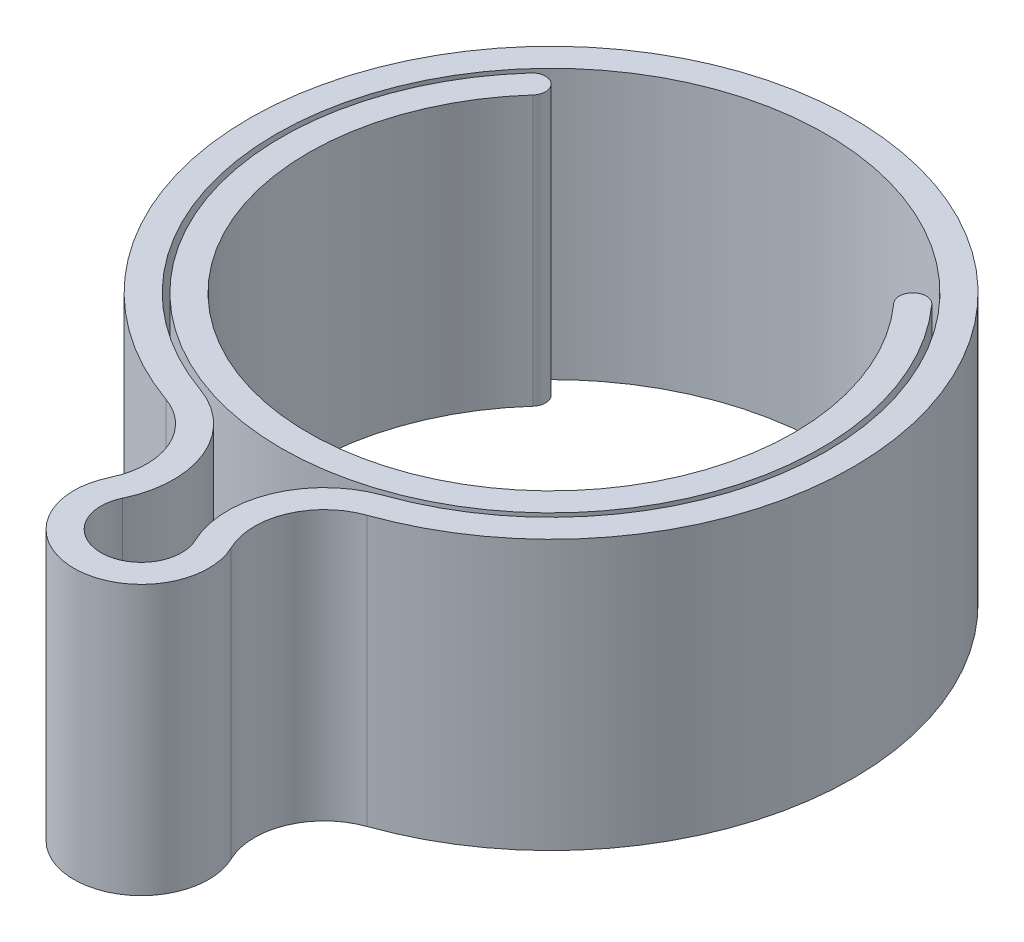
ISO-10303-21;
HEADER;
FILE_DESCRIPTION(('STEP AP214'),'2;1');
FILE_NAME('part.step','',(''),(''),'','','');
FILE_SCHEMA(('AUTOMOTIVE_DESIGN { 1 0 10303 214 1 1 1 1 }'));
ENDSEC;
DATA;
#1=APPLICATION_CONTEXT('core data for automotive mechanical design processes');
#2=APPLICATION_PROTOCOL_DEFINITION('international standard','automotive_design',2000,#1);
#3=PRODUCT_CONTEXT('',#1,'mechanical');
#4=PRODUCT('Part','Part','',(#3));
#5=PRODUCT_RELATED_PRODUCT_CATEGORY('part','',(#4));
#6=PRODUCT_DEFINITION_FORMATION('','',#4);
#7=PRODUCT_DEFINITION_CONTEXT('part definition',#1,'design');
#8=PRODUCT_DEFINITION('design','',#6,#7);
#9=PRODUCT_DEFINITION_SHAPE('','',#8);
#10=(LENGTH_UNIT() NAMED_UNIT(*) SI_UNIT(.MILLI.,.METRE.));
#11=(NAMED_UNIT(*) PLANE_ANGLE_UNIT() SI_UNIT($,.RADIAN.));
#12=(NAMED_UNIT(*) SI_UNIT($,.STERADIAN.) SOLID_ANGLE_UNIT());
#13=UNCERTAINTY_MEASURE_WITH_UNIT(LENGTH_MEASURE(1.E-05),#10,'distance_accuracy_value','');
#14=(GEOMETRIC_REPRESENTATION_CONTEXT(3) GLOBAL_UNCERTAINTY_ASSIGNED_CONTEXT((#13)) GLOBAL_UNIT_ASSIGNED_CONTEXT((#10,
#11,#12)) REPRESENTATION_CONTEXT('',''));
#15=CARTESIAN_POINT('',(0.,0.,0.));
#16=DIRECTION('',(0.,0.,1.));
#17=DIRECTION('',(1.,0.,0.));
#18=AXIS2_PLACEMENT_3D('',#15,#16,#17);
#19=CARTESIAN_POINT('',(0.,5.,7.6));
#20=DIRECTION('',(0.,-1.,0.));
#21=DIRECTION('',(0.,0.,-1.));
#22=AXIS2_PLACEMENT_3D('',#19,#20,#21);
#23=CYLINDRICAL_SURFACE('',#22,0.75);
#24=CARTESIAN_POINT('',(0.,0.,7.6));
#25=DIRECTION('',(0.,1.,0.));
#26=DIRECTION('',(0.,0.,1.));
#27=AXIS2_PLACEMENT_3D('',#24,#25,#26);
#28=CIRCLE('',#27,0.75);
#29=CARTESIAN_POINT('',(-0.676268927813282,0.,7.27571565367062));
#30=VERTEX_POINT('',#29);
#31=CARTESIAN_POINT('',(0.676268927813282,0.,7.27571565367062));
#32=VERTEX_POINT('',#31);
#33=EDGE_CURVE('E178',#30,#32,#28,.T.);
#34=ORIENTED_EDGE('',*,*,#33,.F.);
#35=DIRECTION('',(0.,-1.,0.));
#36=VECTOR('',#35,1.);
#37=CARTESIAN_POINT('',(-0.676268927813282,5.,7.27571565367062));
#38=LINE('',#37,#36);
#39=CARTESIAN_POINT('',(-0.676268927813282,5.,7.27571565367062));
#40=VERTEX_POINT('',#39);
#41=EDGE_CURVE('E13',#40,#30,#38,.T.);
#42=ORIENTED_EDGE('',*,*,#41,.F.);
#43=CARTESIAN_POINT('',(0.,5.,7.6));
#44=DIRECTION('',(0.,1.,0.));
#45=DIRECTION('',(0.,0.,1.));
#46=AXIS2_PLACEMENT_3D('',#43,#44,#45);
#47=CIRCLE('',#46,0.75);
#48=CARTESIAN_POINT('',(0.676268927813282,5.,7.27571565367062));
#49=VERTEX_POINT('',#48);
#50=EDGE_CURVE('E149',#40,#49,#47,.T.);
#51=ORIENTED_EDGE('',*,*,#50,.T.);
#52=DIRECTION('',(0.,-1.,0.));
#53=VECTOR('',#52,1.);
#54=CARTESIAN_POINT('',(0.676268927813282,5.,7.27571565367062));
#55=LINE('',#54,#53);
#56=EDGE_CURVE('E123',#49,#32,#55,.T.);
#57=ORIENTED_EDGE('',*,*,#56,.T.);
#58=EDGE_LOOP('',(#34,#42,#51,#57));
#59=FACE_BOUND('',#58,.T.);
#60=ADVANCED_FACE('F70',(#59),#23,.F.);
#61=CARTESIAN_POINT('',(-2.29302554457871,5.,6.5004488314365));
#62=DIRECTION('',(0.,-1.,0.));
#63=DIRECTION('',(0.,0.,-1.));
#64=AXIS2_PLACEMENT_3D('',#61,#62,#63);
#65=CYLINDRICAL_SURFACE('',#64,1.79302554457871);
#66=CARTESIAN_POINT('',(-2.29302554457871,0.,6.5004488314365));
#67=DIRECTION('',(0.,1.,0.));
#68=DIRECTION('',(0.,0.,1.));
#69=AXIS2_PLACEMENT_3D('',#66,#67,#68);
#70=CIRCLE('',#69,1.79302554457871);
#71=CARTESIAN_POINT('',(-1.69655983453434,0.,4.80954101010115));
#72=VERTEX_POINT('',#71);
#73=EDGE_CURVE('E155',#30,#72,#70,.T.);
#74=ORIENTED_EDGE('',*,*,#73,.T.);
#75=DIRECTION('',(0.,-1.,0.));
#76=VECTOR('',#75,1.);
#77=CARTESIAN_POINT('',(-1.69655983453434,5.,4.80954101010115));
#78=LINE('',#77,#76);
#79=CARTESIAN_POINT('',(-1.69655983453434,5.,4.80954101010115));
#80=VERTEX_POINT('',#79);
#81=EDGE_CURVE('E80',#80,#72,#78,.T.);
#82=ORIENTED_EDGE('',*,*,#81,.F.);
#83=CARTESIAN_POINT('',(-2.29302554457871,5.,6.5004488314365));
#84=DIRECTION('',(0.,1.,0.));
#85=DIRECTION('',(0.,0.,1.));
#86=AXIS2_PLACEMENT_3D('',#83,#84,#85);
#87=CIRCLE('',#86,1.79302554457871);
#88=EDGE_CURVE('E144',#40,#80,#87,.T.);
#89=ORIENTED_EDGE('',*,*,#88,.F.);
#90=ORIENTED_EDGE('',*,*,#41,.T.);
#91=EDGE_LOOP('',(#74,#82,#89,#90));
#92=FACE_BOUND('',#91,.T.);
#93=ADVANCED_FACE('F153',(#92),#65,.T.);
#94=CARTESIAN_POINT('',(0.,5.,0.));
#95=DIRECTION('',(0.,-1.,0.));
#96=DIRECTION('',(0.,0.,-1.));
#97=AXIS2_PLACEMENT_3D('',#94,#95,#96);
#98=CYLINDRICAL_SURFACE('',#97,5.1);
#99=CARTESIAN_POINT('',(0.,0.,0.));
#100=DIRECTION('',(0.,1.,0.));
#101=DIRECTION('',(0.,0.,1.));
#102=AXIS2_PLACEMENT_3D('',#99,#100,#101);
#103=CIRCLE('',#102,5.1);
#104=CARTESIAN_POINT('',(1.69655983453434,0.,4.80954101010115));
#105=VERTEX_POINT('',#104);
#106=EDGE_CURVE('E182',#105,#72,#103,.T.);
#107=ORIENTED_EDGE('',*,*,#106,.F.);
#108=DIRECTION('',(0.,-1.,0.));
#109=VECTOR('',#108,1.);
#110=CARTESIAN_POINT('',(1.69655983453434,5.,4.80954101010115));
#111=LINE('',#110,#109);
#112=CARTESIAN_POINT('',(1.69655983453434,5.,4.80954101010115));
#113=VERTEX_POINT('',#112);
#114=EDGE_CURVE('E116',#113,#105,#111,.T.);
#115=ORIENTED_EDGE('',*,*,#114,.F.);
#116=CARTESIAN_POINT('',(0.,5.,0.));
#117=DIRECTION('',(0.,1.,0.));
#118=DIRECTION('',(0.,0.,1.));
#119=AXIS2_PLACEMENT_3D('',#116,#117,#118);
#120=CIRCLE('',#119,5.1);
#121=EDGE_CURVE('E148',#113,#80,#120,.T.);
#122=ORIENTED_EDGE('',*,*,#121,.T.);
#123=ORIENTED_EDGE('',*,*,#81,.T.);
#124=EDGE_LOOP('',(#107,#115,#122,#123));
#125=FACE_BOUND('',#124,.T.);
#126=ADVANCED_FACE('F160',(#125),#98,.F.);
#127=CARTESIAN_POINT('',(-2.29302554457871,5.,6.5004488314365));
#128=DIRECTION('',(0.,-1.,0.));
#129=DIRECTION('',(0.,0.,-1.));
#130=AXIS2_PLACEMENT_3D('',#127,#128,#129);
#131=CYLINDRICAL_SURFACE('',#130,1.29302554457871);
#132=CARTESIAN_POINT('',(-2.29302554457871,0.,6.5004488314365));
#133=DIRECTION('',(0.,1.,0.));
#134=DIRECTION('',(0.,0.,1.));
#135=AXIS2_PLACEMENT_3D('',#132,#133,#134);
#136=CIRCLE('',#135,1.29302554457871);
#137=CARTESIAN_POINT('',(-1.1271148796888,0.,7.05952608945103));
#138=VERTEX_POINT('',#137);
#139=CARTESIAN_POINT('',(-1.86288923007692,0.,5.28106463854244));
#140=VERTEX_POINT('',#139);
#141=EDGE_CURVE('E166',#138,#140,#136,.T.);
#142=ORIENTED_EDGE('',*,*,#141,.F.);
#143=DIRECTION('',(0.,-1.,0.));
#144=VECTOR('',#143,1.);
#145=CARTESIAN_POINT('',(-1.1271148796888,5.,7.05952608945103));
#146=LINE('',#145,#144);
#147=CARTESIAN_POINT('',(-1.1271148796888,5.,7.05952608945103));
#148=VERTEX_POINT('',#147);
#149=EDGE_CURVE('E74',#148,#138,#146,.T.);
#150=ORIENTED_EDGE('',*,*,#149,.F.);
#151=CARTESIAN_POINT('',(-2.29302554457871,5.,6.5004488314365));
#152=DIRECTION('',(0.,1.,0.));
#153=DIRECTION('',(0.,0.,1.));
#154=AXIS2_PLACEMENT_3D('',#151,#152,#153);
#155=CIRCLE('',#154,1.29302554457871);
#156=CARTESIAN_POINT('',(-1.86288923007692,5.,5.28106463854244));
#157=VERTEX_POINT('',#156);
#158=EDGE_CURVE('E186',#148,#157,#155,.T.);
#159=ORIENTED_EDGE('',*,*,#158,.T.);
#160=DIRECTION('',(0.,-1.,0.));
#161=VECTOR('',#160,1.);
#162=CARTESIAN_POINT('',(-1.86288923007692,5.,5.28106463854244));
#163=LINE('',#162,#161);
#164=EDGE_CURVE('E162',#157,#140,#163,.T.);
#165=ORIENTED_EDGE('',*,*,#164,.T.);
#166=EDGE_LOOP('',(#142,#150,#159,#165));
#167=FACE_BOUND('',#166,.T.);
#168=ADVANCED_FACE('F72',(#167),#131,.F.);
#169=CARTESIAN_POINT('',(0.,5.,7.6));
#170=DIRECTION('',(0.,-1.,0.));
#171=DIRECTION('',(0.,0.,-1.));
#172=AXIS2_PLACEMENT_3D('',#169,#170,#171);
#173=CYLINDRICAL_SURFACE('',#172,1.25);
#174=CARTESIAN_POINT('',(0.,0.,7.6));
#175=DIRECTION('',(0.,1.,0.));
#176=DIRECTION('',(0.,0.,1.));
#177=AXIS2_PLACEMENT_3D('',#174,#175,#176);
#178=CIRCLE('',#177,1.25);
#179=CARTESIAN_POINT('',(1.1271148796888,0.,7.05952608945103));
#180=VERTEX_POINT('',#179);
#181=EDGE_CURVE('E169',#138,#180,#178,.T.);
#182=ORIENTED_EDGE('',*,*,#181,.T.);
#183=DIRECTION('',(0.,-1.,0.));
#184=VECTOR('',#183,1.);
#185=CARTESIAN_POINT('',(1.1271148796888,5.,7.05952608945103));
#186=LINE('',#185,#184);
#187=CARTESIAN_POINT('',(1.1271148796888,5.,7.05952608945103));
#188=VERTEX_POINT('',#187);
#189=EDGE_CURVE('E191',#188,#180,#186,.T.);
#190=ORIENTED_EDGE('',*,*,#189,.F.);
#191=CARTESIAN_POINT('',(0.,5.,7.6));
#192=DIRECTION('',(0.,1.,0.));
#193=DIRECTION('',(0.,0.,1.));
#194=AXIS2_PLACEMENT_3D('',#191,#192,#193);
#195=CIRCLE('',#194,1.25);
#196=EDGE_CURVE('E199',#148,#188,#195,.T.);
#197=ORIENTED_EDGE('',*,*,#196,.F.);
#198=ORIENTED_EDGE('',*,*,#149,.T.);
#199=EDGE_LOOP('',(#182,#190,#197,#198));
#200=FACE_BOUND('',#199,.T.);
#201=ADVANCED_FACE('F198',(#200),#173,.T.);
#202=CARTESIAN_POINT('',(2.29302554457871,5.,6.5004488314365));
#203=DIRECTION('',(0.,-1.,0.));
#204=DIRECTION('',(0.,0.,-1.));
#205=AXIS2_PLACEMENT_3D('',#202,#203,#204);
#206=CYLINDRICAL_SURFACE('',#205,1.29302554457871);
#207=CARTESIAN_POINT('',(2.29302554457871,0.,6.5004488314365));
#208=DIRECTION('',(0.,1.,0.));
#209=DIRECTION('',(0.,0.,1.));
#210=AXIS2_PLACEMENT_3D('',#207,#208,#209);
#211=CIRCLE('',#210,1.29302554457871);
#212=CARTESIAN_POINT('',(1.86288923007692,0.,5.28106463854244));
#213=VERTEX_POINT('',#212);
#214=EDGE_CURVE('E172',#213,#180,#211,.T.);
#215=ORIENTED_EDGE('',*,*,#214,.F.);
#216=DIRECTION('',(0.,-1.,0.));
#217=VECTOR('',#216,1.);
#218=CARTESIAN_POINT('',(1.86288923007692,5.,5.28106463854244));
#219=LINE('',#218,#217);
#220=CARTESIAN_POINT('',(1.86288923007692,5.,5.28106463854244));
#221=VERTEX_POINT('',#220);
#222=EDGE_CURVE('E190',#221,#213,#219,.T.);
#223=ORIENTED_EDGE('',*,*,#222,.F.);
#224=CARTESIAN_POINT('',(2.29302554457871,5.,6.5004488314365));
#225=DIRECTION('',(0.,1.,0.));
#226=DIRECTION('',(0.,0.,1.));
#227=AXIS2_PLACEMENT_3D('',#224,#225,#226);
#228=CIRCLE('',#227,1.29302554457871);
#229=EDGE_CURVE('E211',#221,#188,#228,.T.);
#230=ORIENTED_EDGE('',*,*,#229,.T.);
#231=ORIENTED_EDGE('',*,*,#189,.T.);
#232=EDGE_LOOP('',(#215,#223,#230,#231));
#233=FACE_BOUND('',#232,.T.);
#234=ADVANCED_FACE('F209',(#233),#206,.F.);
#235=CARTESIAN_POINT('',(0.,5.,0.));
#236=DIRECTION('',(0.,-1.,0.));
#237=DIRECTION('',(0.,0.,-1.));
#238=AXIS2_PLACEMENT_3D('',#235,#236,#237);
#239=CYLINDRICAL_SURFACE('',#238,5.6);
#240=CARTESIAN_POINT('',(0.,0.,0.));
#241=DIRECTION('',(0.,1.,0.));
#242=DIRECTION('',(0.,0.,1.));
#243=AXIS2_PLACEMENT_3D('',#240,#241,#242);
#244=CIRCLE('',#243,5.6);
#245=EDGE_CURVE('E175',#213,#140,#244,.T.);
#246=ORIENTED_EDGE('',*,*,#245,.T.);
#247=ORIENTED_EDGE('',*,*,#164,.F.);
#248=CARTESIAN_POINT('',(0.,5.,0.));
#249=DIRECTION('',(0.,1.,0.));
#250=DIRECTION('',(0.,0.,1.));
#251=AXIS2_PLACEMENT_3D('',#248,#249,#250);
#252=CIRCLE('',#251,5.6);
#253=EDGE_CURVE('E212',#221,#157,#252,.T.);
#254=ORIENTED_EDGE('',*,*,#253,.F.);
#255=ORIENTED_EDGE('',*,*,#222,.T.);
#256=EDGE_LOOP('',(#246,#247,#254,#255));
#257=FACE_BOUND('',#256,.T.);
#258=ADVANCED_FACE('F208',(#257),#239,.T.);
#259=CARTESIAN_POINT('',(2.29302554457871,5.,6.5004488314365));
#260=DIRECTION('',(0.,-1.,0.));
#261=DIRECTION('',(0.,0.,-1.));
#262=AXIS2_PLACEMENT_3D('',#259,#260,#261);
#263=CYLINDRICAL_SURFACE('',#262,1.79302554457871);
#264=CARTESIAN_POINT('',(2.29302554457871,0.,6.5004488314365));
#265=DIRECTION('',(0.,1.,0.));
#266=DIRECTION('',(0.,0.,1.));
#267=AXIS2_PLACEMENT_3D('',#264,#265,#266);
#268=CIRCLE('',#267,1.79302554457871);
#269=EDGE_CURVE('E184',#105,#32,#268,.T.);
#270=ORIENTED_EDGE('',*,*,#269,.T.);
#271=ORIENTED_EDGE('',*,*,#56,.F.);
#272=CARTESIAN_POINT('',(2.29302554457871,5.,6.5004488314365));
#273=DIRECTION('',(0.,1.,0.));
#274=DIRECTION('',(0.,0.,1.));
#275=AXIS2_PLACEMENT_3D('',#272,#273,#274);
#276=CIRCLE('',#275,1.79302554457871);
#277=EDGE_CURVE('E89',#113,#49,#276,.T.);
#278=ORIENTED_EDGE('',*,*,#277,.F.);
#279=ORIENTED_EDGE('',*,*,#114,.T.);
#280=EDGE_LOOP('',(#270,#271,#278,#279));
#281=FACE_BOUND('',#280,.T.);
#282=ADVANCED_FACE('F218',(#281),#263,.T.);
#283=CARTESIAN_POINT('',(0.,5.,0.));
#284=DIRECTION('',(0.,1.,0.));
#285=DIRECTION('',(0.,0.,1.));
#286=AXIS2_PLACEMENT_3D('',#283,#284,#285);
#287=PLANE('',#286);
#288=ORIENTED_EDGE('',*,*,#158,.F.);
#289=ORIENTED_EDGE('',*,*,#196,.T.);
#290=ORIENTED_EDGE('',*,*,#229,.F.);
#291=ORIENTED_EDGE('',*,*,#253,.T.);
#292=EDGE_LOOP('',(#288,#289,#290,#291));
#293=FACE_BOUND('',#292,.T.);
#294=ORIENTED_EDGE('',*,*,#50,.F.);
#295=ORIENTED_EDGE('',*,*,#88,.T.);
#296=ORIENTED_EDGE('',*,*,#121,.F.);
#297=ORIENTED_EDGE('',*,*,#277,.T.);
#298=EDGE_LOOP('',(#294,#295,#296,#297));
#299=FACE_BOUND('',#298,.T.);
#300=ADVANCED_FACE('F146',(#293,#299),#287,.T.);
#301=CARTESIAN_POINT('',(0.,0.,0.));
#302=DIRECTION('',(0.,1.,0.));
#303=DIRECTION('',(0.,0.,1.));
#304=AXIS2_PLACEMENT_3D('',#301,#302,#303);
#305=PLANE('',#304);
#306=ORIENTED_EDGE('',*,*,#141,.T.);
#307=ORIENTED_EDGE('',*,*,#245,.F.);
#308=ORIENTED_EDGE('',*,*,#214,.T.);
#309=ORIENTED_EDGE('',*,*,#181,.F.);
#310=EDGE_LOOP('',(#306,#307,#308,#309));
#311=FACE_BOUND('',#310,.T.);
#312=ORIENTED_EDGE('',*,*,#33,.T.);
#313=ORIENTED_EDGE('',*,*,#269,.F.);
#314=ORIENTED_EDGE('',*,*,#106,.T.);
#315=ORIENTED_EDGE('',*,*,#73,.F.);
#316=EDGE_LOOP('',(#312,#313,#314,#315));
#317=FACE_BOUND('',#316,.T.);
#318=ADVANCED_FACE('F202',(#311,#317),#305,.F.);
#319=CLOSED_SHELL('',(#60,#93,#126,#168,#201,#234,#258,#282,#300,#318));
#320=MANIFOLD_SOLID_BREP('B2',#319);
#321=CARTESIAN_POINT('',(0.,5.,0.));
#322=DIRECTION('',(0.,-1.,0.));
#323=DIRECTION('',(0.,0.,-1.));
#324=AXIS2_PLACEMENT_3D('',#321,#322,#323);
#325=CYLINDRICAL_SURFACE('',#324,5.);
#326=CARTESIAN_POINT('',(0.,0.,0.));
#327=DIRECTION('',(0.,1.,0.));
#328=DIRECTION('',(0.,0.,1.));
#329=AXIS2_PLACEMENT_3D('',#326,#327,#328);
#330=CIRCLE('',#329,5.);
#331=CARTESIAN_POINT('',(-3.71671438057505,0.,-3.3445529167927));
#332=VERTEX_POINT('',#331);
#333=CARTESIAN_POINT('',(3.71671438057508,0.,-3.34455291679267));
#334=VERTEX_POINT('',#333);
#335=EDGE_CURVE('E361',#332,#334,#330,.T.);
#336=ORIENTED_EDGE('',*,*,#335,.T.);
#337=DIRECTION('',(0.,-1.,0.));
#338=VECTOR('',#337,1.);
#339=CARTESIAN_POINT('',(3.71671438057508,5.,-3.34455291679267));
#340=LINE('',#339,#338);
#341=CARTESIAN_POINT('',(3.71671438057508,5.,-3.34455291679267));
#342=VERTEX_POINT('',#341);
#343=EDGE_CURVE('E68',#342,#334,#340,.T.);
#344=ORIENTED_EDGE('',*,*,#343,.F.);
#345=CARTESIAN_POINT('',(0.,5.,0.));
#346=DIRECTION('',(0.,1.,0.));
#347=DIRECTION('',(0.,0.,1.));
#348=AXIS2_PLACEMENT_3D('',#345,#346,#347);
#349=CIRCLE('',#348,5.);
#350=CARTESIAN_POINT('',(-3.71671438057505,5.,-3.3445529167927));
#351=VERTEX_POINT('',#350);
#352=EDGE_CURVE('E346',#351,#342,#349,.T.);
#353=ORIENTED_EDGE('',*,*,#352,.F.);
#354=DIRECTION('',(0.,-1.,0.));
#355=VECTOR('',#354,1.);
#356=CARTESIAN_POINT('',(-3.71671438057505,5.,-3.3445529167927));
#357=LINE('',#356,#355);
#358=EDGE_CURVE('E357',#351,#332,#357,.T.);
#359=ORIENTED_EDGE('',*,*,#358,.T.);
#360=EDGE_LOOP('',(#336,#344,#353,#359));
#361=FACE_BOUND('',#360,.T.);
#362=ADVANCED_FACE('F299',(#361),#325,.T.);
#363=CARTESIAN_POINT('',(3.53087866154633,5.,-3.17732527095304));
#364=DIRECTION('',(0.,-1.,0.));
#365=DIRECTION('',(0.,0.,-1.));
#366=AXIS2_PLACEMENT_3D('',#363,#364,#365);
#367=CYLINDRICAL_SURFACE('',#366,0.249999999999999);
#368=CARTESIAN_POINT('',(3.53087866154633,0.,-3.17732527095304));
#369=DIRECTION('',(0.,1.,0.));
#370=DIRECTION('',(0.,0.,1.));
#371=AXIS2_PLACEMENT_3D('',#368,#369,#370);
#372=CIRCLE('',#371,0.249999999999999);
#373=CARTESIAN_POINT('',(3.34504294251757,0.,-3.01009762511341));
#374=VERTEX_POINT('',#373);
#375=EDGE_CURVE('E351',#334,#374,#372,.T.);
#376=ORIENTED_EDGE('',*,*,#375,.T.);
#377=DIRECTION('',(0.,-1.,0.));
#378=VECTOR('',#377,1.);
#379=CARTESIAN_POINT('',(3.34504294251757,5.,-3.01009762511341));
#380=LINE('',#379,#378);
#381=CARTESIAN_POINT('',(3.34504294251757,5.,-3.01009762511341));
#382=VERTEX_POINT('',#381);
#383=EDGE_CURVE('E307',#382,#374,#380,.T.);
#384=ORIENTED_EDGE('',*,*,#383,.F.);
#385=CARTESIAN_POINT('',(3.53087866154633,5.,-3.17732527095304));
#386=DIRECTION('',(0.,1.,0.));
#387=DIRECTION('',(0.,0.,1.));
#388=AXIS2_PLACEMENT_3D('',#385,#386,#387);
#389=CIRCLE('',#388,0.249999999999999);
#390=EDGE_CURVE('E341',#342,#382,#389,.T.);
#391=ORIENTED_EDGE('',*,*,#390,.F.);
#392=ORIENTED_EDGE('',*,*,#343,.T.);
#393=EDGE_LOOP('',(#376,#384,#391,#392));
#394=FACE_BOUND('',#393,.T.);
#395=ADVANCED_FACE('F350',(#394),#367,.T.);
#396=CARTESIAN_POINT('',(0.,5.,0.));
#397=DIRECTION('',(0.,-1.,0.));
#398=DIRECTION('',(0.,0.,-1.));
#399=AXIS2_PLACEMENT_3D('',#396,#397,#398);
#400=CYLINDRICAL_SURFACE('',#399,4.5);
#401=CARTESIAN_POINT('',(0.,0.,0.));
#402=DIRECTION('',(0.,1.,0.));
#403=DIRECTION('',(0.,0.,1.));
#404=AXIS2_PLACEMENT_3D('',#401,#402,#403);
#405=CIRCLE('',#404,4.5);
#406=CARTESIAN_POINT('',(-3.34504294251755,0.,-3.01009762511343));
#407=VERTEX_POINT('',#406);
#408=EDGE_CURVE('E365',#407,#374,#405,.T.);
#409=ORIENTED_EDGE('',*,*,#408,.F.);
#410=DIRECTION('',(0.,-1.,0.));
#411=VECTOR('',#410,1.);
#412=CARTESIAN_POINT('',(-3.34504294251755,5.,-3.01009762511343));
#413=LINE('',#412,#411);
#414=CARTESIAN_POINT('',(-3.34504294251755,5.,-3.01009762511343));
#415=VERTEX_POINT('',#414);
#416=EDGE_CURVE('E331',#415,#407,#413,.T.);
#417=ORIENTED_EDGE('',*,*,#416,.F.);
#418=CARTESIAN_POINT('',(0.,5.,0.));
#419=DIRECTION('',(0.,1.,0.));
#420=DIRECTION('',(0.,0.,1.));
#421=AXIS2_PLACEMENT_3D('',#418,#419,#420);
#422=CIRCLE('',#421,4.5);
#423=EDGE_CURVE('E344',#415,#382,#422,.T.);
#424=ORIENTED_EDGE('',*,*,#423,.T.);
#425=ORIENTED_EDGE('',*,*,#383,.T.);
#426=EDGE_LOOP('',(#409,#417,#424,#425));
#427=FACE_BOUND('',#426,.T.);
#428=ADVANCED_FACE('F355',(#427),#400,.F.);
#429=CARTESIAN_POINT('',(-3.5308786615463,5.,-3.17732527095306));
#430=DIRECTION('',(0.,-1.,0.));
#431=DIRECTION('',(0.,0.,-1.));
#432=AXIS2_PLACEMENT_3D('',#429,#430,#431);
#433=CYLINDRICAL_SURFACE('',#432,0.249999999999999);
#434=CARTESIAN_POINT('',(-3.5308786615463,0.,-3.17732527095306));
#435=DIRECTION('',(0.,1.,0.));
#436=DIRECTION('',(0.,0.,1.));
#437=AXIS2_PLACEMENT_3D('',#434,#435,#436);
#438=CIRCLE('',#437,0.249999999999999);
#439=EDGE_CURVE('E334',#407,#332,#438,.T.);
#440=ORIENTED_EDGE('',*,*,#439,.T.);
#441=ORIENTED_EDGE('',*,*,#358,.F.);
#442=CARTESIAN_POINT('',(-3.5308786615463,5.,-3.17732527095306));
#443=DIRECTION('',(0.,1.,0.));
#444=DIRECTION('',(0.,0.,1.));
#445=AXIS2_PLACEMENT_3D('',#442,#443,#444);
#446=CIRCLE('',#445,0.249999999999999);
#447=EDGE_CURVE('E315',#415,#351,#446,.T.);
#448=ORIENTED_EDGE('',*,*,#447,.F.);
#449=ORIENTED_EDGE('',*,*,#416,.T.);
#450=EDGE_LOOP('',(#440,#441,#448,#449));
#451=FACE_BOUND('',#450,.T.);
#452=ADVANCED_FACE('F378',(#451),#433,.T.);
#453=CARTESIAN_POINT('',(0.,5.,0.));
#454=DIRECTION('',(0.,1.,0.));
#455=DIRECTION('',(0.,0.,1.));
#456=AXIS2_PLACEMENT_3D('',#453,#454,#455);
#457=PLANE('',#456);
#458=ORIENTED_EDGE('',*,*,#352,.T.);
#459=ORIENTED_EDGE('',*,*,#390,.T.);
#460=ORIENTED_EDGE('',*,*,#423,.F.);
#461=ORIENTED_EDGE('',*,*,#447,.T.);
#462=EDGE_LOOP('',(#458,#459,#460,#461));
#463=FACE_BOUND('',#462,.T.);
#464=ADVANCED_FACE('F342',(#463),#457,.T.);
#465=CARTESIAN_POINT('',(0.,0.,0.));
#466=DIRECTION('',(0.,1.,0.));
#467=DIRECTION('',(0.,0.,1.));
#468=AXIS2_PLACEMENT_3D('',#465,#466,#467);
#469=PLANE('',#468);
#470=ORIENTED_EDGE('',*,*,#335,.F.);
#471=ORIENTED_EDGE('',*,*,#439,.F.);
#472=ORIENTED_EDGE('',*,*,#408,.T.);
#473=ORIENTED_EDGE('',*,*,#375,.F.);
#474=EDGE_LOOP('',(#470,#471,#472,#473));
#475=FACE_BOUND('',#474,.T.);
#476=ADVANCED_FACE('F372',(#475),#469,.F.);
#477=CLOSED_SHELL('',(#362,#395,#428,#452,#464,#476));
#478=MANIFOLD_SOLID_BREP('B7',#477);
#479=ADVANCED_BREP_SHAPE_REPRESENTATION('',(#18,#320,#478),#14);
#480=SHAPE_DEFINITION_REPRESENTATION(#9,#479);
ENDSEC;
END-ISO-10303-21;
